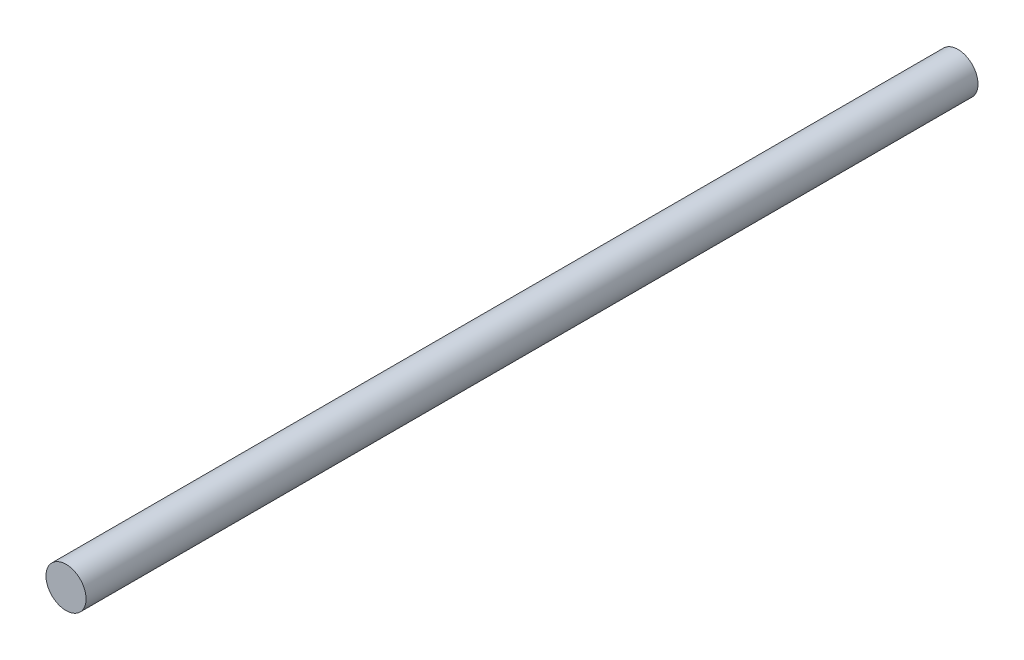
ISO-10303-21;
HEADER;
FILE_DESCRIPTION(('STEP AP214'),'2;1');
FILE_NAME('part.step','',(''),(''),'','','');
FILE_SCHEMA(('AUTOMOTIVE_DESIGN { 1 0 10303 214 1 1 1 1 }'));
ENDSEC;
DATA;
#1=APPLICATION_CONTEXT('core data for automotive mechanical design processes');
#2=APPLICATION_PROTOCOL_DEFINITION('international standard','automotive_design',2000,#1);
#3=PRODUCT_CONTEXT('',#1,'mechanical');
#4=PRODUCT('Part','Part','',(#3));
#5=PRODUCT_RELATED_PRODUCT_CATEGORY('part','',(#4));
#6=PRODUCT_DEFINITION_FORMATION('','',#4);
#7=PRODUCT_DEFINITION_CONTEXT('part definition',#1,'design');
#8=PRODUCT_DEFINITION('design','',#6,#7);
#9=PRODUCT_DEFINITION_SHAPE('','',#8);
#10=(LENGTH_UNIT() NAMED_UNIT(*) SI_UNIT(.MILLI.,.METRE.));
#11=(NAMED_UNIT(*) PLANE_ANGLE_UNIT() SI_UNIT($,.RADIAN.));
#12=(NAMED_UNIT(*) SI_UNIT($,.STERADIAN.) SOLID_ANGLE_UNIT());
#13=UNCERTAINTY_MEASURE_WITH_UNIT(LENGTH_MEASURE(1.E-05),#10,'distance_accuracy_value','');
#14=(GEOMETRIC_REPRESENTATION_CONTEXT(3) GLOBAL_UNCERTAINTY_ASSIGNED_CONTEXT((#13)) GLOBAL_UNIT_ASSIGNED_CONTEXT((#10,
#11,#12)) REPRESENTATION_CONTEXT('',''));
#15=CARTESIAN_POINT('',(0.,0.,0.));
#16=DIRECTION('',(0.,0.,1.));
#17=DIRECTION('',(1.,0.,0.));
#18=AXIS2_PLACEMENT_3D('',#15,#16,#17);
#19=CARTESIAN_POINT('',(0.,0.,400.));
#20=DIRECTION('',(0.,0.,-1.));
#21=DIRECTION('',(-1.,0.,0.));
#22=AXIS2_PLACEMENT_3D('',#19,#20,#21);
#23=CYLINDRICAL_SURFACE('',#22,9.);
#24=CARTESIAN_POINT('',(0.,0.,400.));
#25=DIRECTION('',(0.,0.,1.));
#26=DIRECTION('',(1.,0.,0.));
#27=AXIS2_PLACEMENT_3D('',#24,#25,#26);
#28=CIRCLE('',#27,9.);
#29=CARTESIAN_POINT('',(9.,0.,400.));
#30=VERTEX_POINT('',#29);
#31=EDGE_CURVE('E10',#30,#30,#28,.T.);
#32=ORIENTED_EDGE('',*,*,#31,.F.);
#33=EDGE_LOOP('',(#32));
#34=FACE_BOUND('',#33,.T.);
#35=CARTESIAN_POINT('',(0.,0.,0.));
#36=DIRECTION('',(0.,0.,1.));
#37=DIRECTION('',(1.,0.,0.));
#38=AXIS2_PLACEMENT_3D('',#35,#36,#37);
#39=CIRCLE('',#38,9.);
#40=CARTESIAN_POINT('',(9.,0.,0.));
#41=VERTEX_POINT('',#40);
#42=EDGE_CURVE('E34',#41,#41,#39,.T.);
#43=ORIENTED_EDGE('',*,*,#42,.T.);
#44=EDGE_LOOP('',(#43));
#45=FACE_BOUND('',#44,.T.);
#46=ADVANCED_FACE('F31',(#34,#45),#23,.T.);
#47=CARTESIAN_POINT('',(0.,0.,400.));
#48=DIRECTION('',(0.,0.,1.));
#49=DIRECTION('',(1.,0.,0.));
#50=AXIS2_PLACEMENT_3D('',#47,#48,#49);
#51=PLANE('',#50);
#52=ORIENTED_EDGE('',*,*,#31,.T.);
#53=EDGE_LOOP('',(#52));
#54=FACE_BOUND('',#53,.T.);
#55=ADVANCED_FACE('F46',(#54),#51,.T.);
#56=CARTESIAN_POINT('',(0.,0.,0.));
#57=DIRECTION('',(0.,0.,1.));
#58=DIRECTION('',(1.,0.,0.));
#59=AXIS2_PLACEMENT_3D('',#56,#57,#58);
#60=PLANE('',#59);
#61=ORIENTED_EDGE('',*,*,#42,.F.);
#62=EDGE_LOOP('',(#61));
#63=FACE_BOUND('',#62,.T.);
#64=ADVANCED_FACE('F44',(#63),#60,.F.);
#65=CLOSED_SHELL('',(#46,#55,#64));
#66=MANIFOLD_SOLID_BREP('B2',#65);
#67=ADVANCED_BREP_SHAPE_REPRESENTATION('',(#18,#66),#14);
#68=SHAPE_DEFINITION_REPRESENTATION(#9,#67);
ENDSEC;
END-ISO-10303-21;
